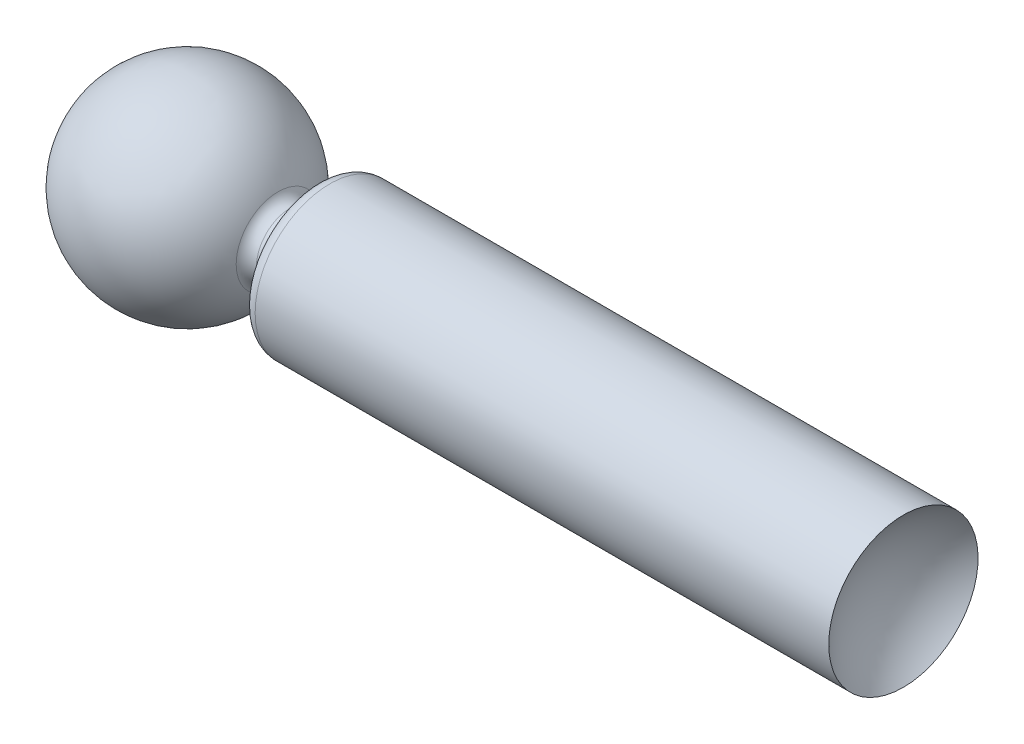
ISO-10303-21;
HEADER;
FILE_DESCRIPTION(('STEP AP214'),'2;1');
FILE_NAME('part.step','',(''),(''),'','','');
FILE_SCHEMA(('AUTOMOTIVE_DESIGN { 1 0 10303 214 1 1 1 1 }'));
ENDSEC;
DATA;
#1=APPLICATION_CONTEXT('core data for automotive mechanical design processes');
#2=APPLICATION_PROTOCOL_DEFINITION('international standard','automotive_design',2000,#1);
#3=PRODUCT_CONTEXT('',#1,'mechanical');
#4=PRODUCT('Part','Part','',(#3));
#5=PRODUCT_RELATED_PRODUCT_CATEGORY('part','',(#4));
#6=PRODUCT_DEFINITION_FORMATION('','',#4);
#7=PRODUCT_DEFINITION_CONTEXT('part definition',#1,'design');
#8=PRODUCT_DEFINITION('design','',#6,#7);
#9=PRODUCT_DEFINITION_SHAPE('','',#8);
#10=(LENGTH_UNIT() NAMED_UNIT(*) SI_UNIT(.MILLI.,.METRE.));
#11=(NAMED_UNIT(*) PLANE_ANGLE_UNIT() SI_UNIT($,.RADIAN.));
#12=(NAMED_UNIT(*) SI_UNIT($,.STERADIAN.) SOLID_ANGLE_UNIT());
#13=UNCERTAINTY_MEASURE_WITH_UNIT(LENGTH_MEASURE(1.E-05),#10,'distance_accuracy_value','');
#14=(GEOMETRIC_REPRESENTATION_CONTEXT(3) GLOBAL_UNCERTAINTY_ASSIGNED_CONTEXT((#13)) GLOBAL_UNIT_ASSIGNED_CONTEXT((#10,
#11,#12)) REPRESENTATION_CONTEXT('',''));
#15=CARTESIAN_POINT('',(0.,0.,0.));
#16=DIRECTION('',(0.,0.,1.));
#17=DIRECTION('',(1.,0.,0.));
#18=AXIS2_PLACEMENT_3D('',#15,#16,#17);
#19=CARTESIAN_POINT('',(73.4822,0.,0.));
#20=DIRECTION('',(-1.,0.,0.));
#21=DIRECTION('',(0.,-1.,0.));
#22=AXIS2_PLACEMENT_3D('',#19,#20,#21);
#23=SPHERICAL_SURFACE('',#22,9.525);
#24=CARTESIAN_POINT('',(67.0064452177372,0.,0.));
#25=DIRECTION('',(-1.,0.,0.));
#26=DIRECTION('',(0.,0.,1.));
#27=AXIS2_PLACEMENT_3D('',#24,#25,#26);
#28=CIRCLE('',#27,6.985);
#29=CARTESIAN_POINT('',(67.0064452177372,0.,6.985));
#30=VERTEX_POINT('',#29);
#31=EDGE_CURVE('E10',#30,#30,#28,.T.);
#32=ORIENTED_EDGE('',*,*,#31,.F.);
#33=EDGE_LOOP('',(#32));
#34=FACE_BOUND('',#33,.T.);
#35=ADVANCED_FACE('F37',(#34),#23,.F.);
#36=CARTESIAN_POINT('',(-323.172189465464,0.,0.));
#37=DIRECTION('',(-1.,0.,0.));
#38=DIRECTION('',(0.,0.,1.));
#39=AXIS2_PLACEMENT_3D('',#36,#37,#38);
#40=CYLINDRICAL_SURFACE('',#39,6.985);
#41=CARTESIAN_POINT('',(13.335,0.,0.));
#42=DIRECTION('',(-1.,0.,0.));
#43=DIRECTION('',(0.,0.,1.));
#44=AXIS2_PLACEMENT_3D('',#41,#42,#43);
#45=CIRCLE('',#44,6.985);
#46=CARTESIAN_POINT('',(13.335,0.,6.985));
#47=VERTEX_POINT('',#46);
#48=EDGE_CURVE('E43',#47,#47,#45,.T.);
#49=ORIENTED_EDGE('',*,*,#48,.F.);
#50=EDGE_LOOP('',(#49));
#51=FACE_BOUND('',#50,.T.);
#52=ORIENTED_EDGE('',*,*,#31,.T.);
#53=EDGE_LOOP('',(#52));
#54=FACE_BOUND('',#53,.T.);
#55=ADVANCED_FACE('F94',(#51,#54),#40,.T.);
#56=CARTESIAN_POINT('',(13.335,0.,0.));
#57=DIRECTION('',(-1.,0.,0.));
#58=DIRECTION('',(0.,0.,1.));
#59=AXIS2_PLACEMENT_3D('',#56,#57,#58);
#60=TOROIDAL_SURFACE('',#59,5.715,1.27);
#61=CARTESIAN_POINT('',(12.065,0.,0.));
#62=DIRECTION('',(-1.,0.,0.));
#63=DIRECTION('',(0.,0.,1.));
#64=AXIS2_PLACEMENT_3D('',#61,#62,#63);
#65=CIRCLE('',#64,5.71499999999999);
#66=CARTESIAN_POINT('',(12.065,0.,5.71499999999999));
#67=VERTEX_POINT('',#66);
#68=EDGE_CURVE('E47',#67,#67,#65,.T.);
#69=ORIENTED_EDGE('',*,*,#68,.F.);
#70=EDGE_LOOP('',(#69));
#71=FACE_BOUND('',#70,.T.);
#72=ORIENTED_EDGE('',*,*,#48,.T.);
#73=EDGE_LOOP('',(#72));
#74=FACE_BOUND('',#73,.T.);
#75=ADVANCED_FACE('F89',(#71,#74),#60,.T.);
#76=CARTESIAN_POINT('',(12.065,4.44500000000001,0.));
#77=DIRECTION('',(1.,0.,0.));
#78=DIRECTION('',(0.,0.,-1.));
#79=AXIS2_PLACEMENT_3D('',#76,#77,#78);
#80=PLANE('',#79);
#81=CARTESIAN_POINT('',(12.065,0.,0.));
#82=DIRECTION('',(-1.,0.,0.));
#83=DIRECTION('',(0.,0.,1.));
#84=AXIS2_PLACEMENT_3D('',#81,#82,#83);
#85=CIRCLE('',#84,4.445);
#86=CARTESIAN_POINT('',(12.065,0.,4.445));
#87=VERTEX_POINT('',#86);
#88=EDGE_CURVE('E51',#87,#87,#85,.T.);
#89=ORIENTED_EDGE('',*,*,#88,.F.);
#90=EDGE_LOOP('',(#89));
#91=FACE_BOUND('',#90,.T.);
#92=ORIENTED_EDGE('',*,*,#68,.T.);
#93=EDGE_LOOP('',(#92));
#94=FACE_BOUND('',#93,.T.);
#95=ADVANCED_FACE('F83',(#91,#94),#80,.F.);
#96=CARTESIAN_POINT('',(10.795,0.,0.));
#97=DIRECTION('',(-1.,0.,0.));
#98=DIRECTION('',(0.,0.,1.));
#99=AXIS2_PLACEMENT_3D('',#96,#97,#98);
#100=TOROIDAL_SURFACE('',#99,4.445,1.27);
#101=CARTESIAN_POINT('',(10.795,0.,0.));
#102=DIRECTION('',(-1.,0.,0.));
#103=DIRECTION('',(0.,0.,1.));
#104=AXIS2_PLACEMENT_3D('',#101,#102,#103);
#105=CIRCLE('',#104,3.175);
#106=CARTESIAN_POINT('',(10.795,0.,3.175));
#107=VERTEX_POINT('',#106);
#108=EDGE_CURVE('E56',#107,#107,#105,.T.);
#109=ORIENTED_EDGE('',*,*,#108,.F.);
#110=EDGE_LOOP('',(#109));
#111=FACE_BOUND('',#110,.T.);
#112=ORIENTED_EDGE('',*,*,#88,.T.);
#113=EDGE_LOOP('',(#112));
#114=FACE_BOUND('',#113,.T.);
#115=ADVANCED_FACE('F77',(#111,#114),#100,.F.);
#116=CARTESIAN_POINT('',(-323.172189465464,0.,0.));
#117=DIRECTION('',(-1.,0.,0.));
#118=DIRECTION('',(0.,0.,1.));
#119=AXIS2_PLACEMENT_3D('',#116,#117,#118);
#120=CYLINDRICAL_SURFACE('',#119,3.175);
#121=CARTESIAN_POINT('',(9.64193501533794,0.,0.));
#122=DIRECTION('',(-1.,0.,0.));
#123=DIRECTION('',(0.,0.,1.));
#124=AXIS2_PLACEMENT_3D('',#121,#122,#123);
#125=CIRCLE('',#124,3.175);
#126=CARTESIAN_POINT('',(9.64193501533794,0.,3.175));
#127=VERTEX_POINT('',#126);
#128=EDGE_CURVE('E59',#127,#127,#125,.T.);
#129=ORIENTED_EDGE('',*,*,#128,.F.);
#130=EDGE_LOOP('',(#129));
#131=FACE_BOUND('',#130,.T.);
#132=ORIENTED_EDGE('',*,*,#108,.T.);
#133=EDGE_LOOP('',(#132));
#134=FACE_BOUND('',#133,.T.);
#135=ADVANCED_FACE('F71',(#131,#134),#120,.T.);
#136=CARTESIAN_POINT('',(9.64193501533795,0.,0.));
#137=DIRECTION('',(-1.,0.,0.));
#138=DIRECTION('',(0.,0.,1.));
#139=AXIS2_PLACEMENT_3D('',#136,#137,#138);
#140=TOROIDAL_SURFACE('',#139,4.445,1.27);
#141=CARTESIAN_POINT('',(8.48859350632625,0.,0.));
#142=DIRECTION('',(-1.,0.,0.));
#143=DIRECTION('',(0.,0.,1.));
#144=AXIS2_PLACEMENT_3D('',#141,#142,#143);
#145=CIRCLE('',#144,3.9133014354067);
#146=CARTESIAN_POINT('',(8.48859350632625,0.,3.9133014354067));
#147=VERTEX_POINT('',#146);
#148=EDGE_CURVE('E62',#147,#147,#145,.T.);
#149=ORIENTED_EDGE('',*,*,#148,.F.);
#150=EDGE_LOOP('',(#149));
#151=FACE_BOUND('',#150,.T.);
#152=ORIENTED_EDGE('',*,*,#128,.T.);
#153=EDGE_LOOP('',(#152));
#154=FACE_BOUND('',#153,.T.);
#155=ADVANCED_FACE('F68',(#151,#154),#140,.F.);
#156=CARTESIAN_POINT('',(0.,0.,0.));
#157=DIRECTION('',(-1.,0.,0.));
#158=DIRECTION('',(0.,1.,0.));
#159=AXIS2_PLACEMENT_3D('',#156,#157,#158);
#160=SPHERICAL_SURFACE('',#159,9.3472);
#161=ORIENTED_EDGE('',*,*,#148,.T.);
#162=EDGE_LOOP('',(#161));
#163=FACE_BOUND('',#162,.T.);
#164=ADVANCED_FACE('F66',(#163),#160,.T.);
#165=CLOSED_SHELL('',(#35,#55,#75,#95,#115,#135,#155,#164));
#166=MANIFOLD_SOLID_BREP('B2',#165);
#167=ADVANCED_BREP_SHAPE_REPRESENTATION('',(#18,#166),#14);
#168=SHAPE_DEFINITION_REPRESENTATION(#9,#167);
ENDSEC;
END-ISO-10303-21;
